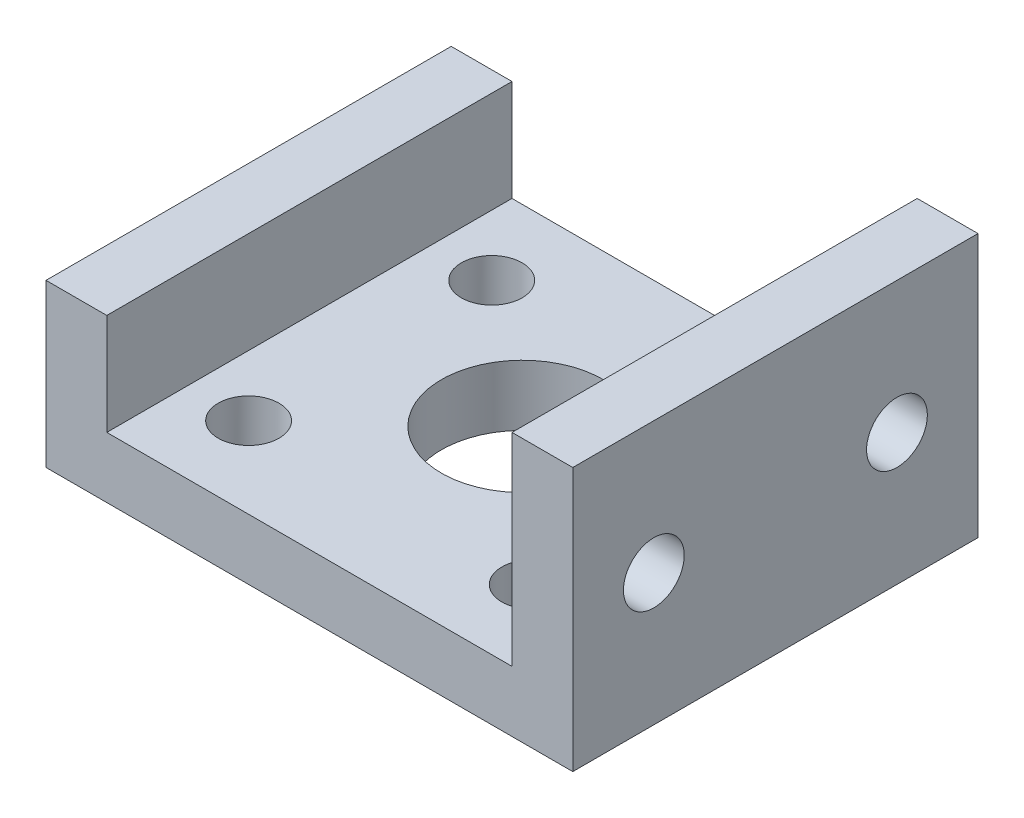
ISO-10303-21;
HEADER;
FILE_DESCRIPTION(('STEP AP214'),'2;1');
FILE_NAME('part.step','',(''),(''),'','','');
FILE_SCHEMA(('AUTOMOTIVE_DESIGN { 1 0 10303 214 1 1 1 1 }'));
ENDSEC;
DATA;
#1=APPLICATION_CONTEXT('core data for automotive mechanical design processes');
#2=APPLICATION_PROTOCOL_DEFINITION('international standard','automotive_design',2000,#1);
#3=PRODUCT_CONTEXT('',#1,'mechanical');
#4=PRODUCT('Part','Part','',(#3));
#5=PRODUCT_RELATED_PRODUCT_CATEGORY('part','',(#4));
#6=PRODUCT_DEFINITION_FORMATION('','',#4);
#7=PRODUCT_DEFINITION_CONTEXT('part definition',#1,'design');
#8=PRODUCT_DEFINITION('design','',#6,#7);
#9=PRODUCT_DEFINITION_SHAPE('','',#8);
#10=(LENGTH_UNIT() NAMED_UNIT(*) SI_UNIT(.MILLI.,.METRE.));
#11=(NAMED_UNIT(*) PLANE_ANGLE_UNIT() SI_UNIT($,.RADIAN.));
#12=(NAMED_UNIT(*) SI_UNIT($,.STERADIAN.) SOLID_ANGLE_UNIT());
#13=UNCERTAINTY_MEASURE_WITH_UNIT(LENGTH_MEASURE(1.E-05),#10,'distance_accuracy_value','');
#14=(GEOMETRIC_REPRESENTATION_CONTEXT(3) GLOBAL_UNCERTAINTY_ASSIGNED_CONTEXT((#13)) GLOBAL_UNIT_ASSIGNED_CONTEXT((#10,
#11,#12)) REPRESENTATION_CONTEXT('',''));
#15=CARTESIAN_POINT('',(0.,0.,0.));
#16=DIRECTION('',(0.,0.,1.));
#17=DIRECTION('',(1.,0.,0.));
#18=AXIS2_PLACEMENT_3D('',#15,#16,#17);
#19=CARTESIAN_POINT('',(0.,0.,160.));
#20=DIRECTION('',(0.,0.,1.));
#21=DIRECTION('',(1.,0.,0.));
#22=AXIS2_PLACEMENT_3D('',#19,#20,#21);
#23=PLANE('',#22);
#24=DIRECTION('',(-1.,0.,0.));
#25=VECTOR('',#24,1.);
#26=CARTESIAN_POINT('',(17.3600305157121,-26.5,160.));
#27=LINE('',#26,#25);
#28=CARTESIAN_POINT('',(17.3600305157121,-26.5,160.));
#29=VERTEX_POINT('',#28);
#30=CARTESIAN_POINT('',(14.3600305157121,-26.5,160.));
#31=VERTEX_POINT('',#30);
#32=EDGE_CURVE('E78',#29,#31,#27,.T.);
#33=ORIENTED_EDGE('',*,*,#32,.T.);
#34=DIRECTION('',(0.,-1.,0.));
#35=VECTOR('',#34,1.);
#36=CARTESIAN_POINT('',(14.3600305157121,36.5,160.));
#37=LINE('',#36,#35);
#38=CARTESIAN_POINT('',(14.3600305157121,-36.5,160.));
#39=VERTEX_POINT('',#38);
#40=EDGE_CURVE('E143',#31,#39,#37,.T.);
#41=ORIENTED_EDGE('',*,*,#40,.T.);
#42=DIRECTION('',(-1.,0.,0.));
#43=VECTOR('',#42,1.);
#44=CARTESIAN_POINT('',(14.3600305157121,-36.5,160.));
#45=LINE('',#44,#43);
#46=CARTESIAN_POINT('',(-5.63996948428791,-36.5,160.));
#47=VERTEX_POINT('',#46);
#48=EDGE_CURVE('E144',#39,#47,#45,.T.);
#49=ORIENTED_EDGE('',*,*,#48,.T.);
#50=DIRECTION('',(0.,1.,0.));
#51=VECTOR('',#50,1.);
#52=CARTESIAN_POINT('',(-5.63996948428791,-36.5,160.));
#53=LINE('',#52,#51);
#54=CARTESIAN_POINT('',(-5.63996948428794,-31.5,160.));
#55=VERTEX_POINT('',#54);
#56=EDGE_CURVE('E147',#47,#55,#53,.T.);
#57=ORIENTED_EDGE('',*,*,#56,.T.);
#58=DIRECTION('',(-1.,0.,0.));
#59=VECTOR('',#58,1.);
#60=CARTESIAN_POINT('',(-8.63996948428794,-31.5,160.));
#61=LINE('',#60,#59);
#62=CARTESIAN_POINT('',(-8.63996948428794,-31.5,160.));
#63=VERTEX_POINT('',#62);
#64=EDGE_CURVE('E129',#55,#63,#61,.T.);
#65=ORIENTED_EDGE('',*,*,#64,.T.);
#66=DIRECTION('',(0.,-1.,0.));
#67=VECTOR('',#66,1.);
#68=CARTESIAN_POINT('',(-8.6399694842879,-35.5,160.));
#69=LINE('',#68,#67);
#70=CARTESIAN_POINT('',(-8.6399694842879,-39.5,160.));
#71=VERTEX_POINT('',#70);
#72=EDGE_CURVE('E176',#63,#71,#69,.T.);
#73=ORIENTED_EDGE('',*,*,#72,.T.);
#74=DIRECTION('',(1.,0.,0.));
#75=VECTOR('',#74,1.);
#76=CARTESIAN_POINT('',(17.3600305157121,-39.5,160.));
#77=LINE('',#76,#75);
#78=CARTESIAN_POINT('',(17.3600305157121,-39.5,160.));
#79=VERTEX_POINT('',#78);
#80=EDGE_CURVE('E88',#71,#79,#77,.T.);
#81=ORIENTED_EDGE('',*,*,#80,.T.);
#82=DIRECTION('',(0.,1.,0.));
#83=VECTOR('',#82,1.);
#84=CARTESIAN_POINT('',(17.3600305157121,39.5,160.));
#85=LINE('',#84,#83);
#86=EDGE_CURVE('E40',#79,#29,#85,.T.);
#87=ORIENTED_EDGE('',*,*,#86,.T.);
#88=EDGE_LOOP('',(#33,#41,#49,#57,#65,#73,#81,#87));
#89=FACE_BOUND('',#88,.T.);
#90=ADVANCED_FACE('F36',(#89),#23,.T.);
#91=CARTESIAN_POINT('',(17.3600305157121,39.5,160.));
#92=DIRECTION('',(-1.,0.,0.));
#93=DIRECTION('',(0.,-1.,0.));
#94=AXIS2_PLACEMENT_3D('',#91,#92,#93);
#95=PLANE('',#94);
#96=CARTESIAN_POINT('',(17.3600305157121,-33.0000000000008,156.));
#97=DIRECTION('',(1.,0.,0.));
#98=DIRECTION('',(0.,1.,0.));
#99=AXIS2_PLACEMENT_3D('',#96,#97,#98);
#100=CIRCLE('',#99,1.5);
#101=CARTESIAN_POINT('',(17.3600305157121,-31.5000000000008,156.));
#102=VERTEX_POINT('',#101);
#103=EDGE_CURVE('E149',#102,#102,#100,.T.);
#104=ORIENTED_EDGE('',*,*,#103,.F.);
#105=EDGE_LOOP('',(#104));
#106=FACE_BOUND('',#105,.T.);
#107=CARTESIAN_POINT('',(17.3600305157121,-33.0000000000008,144.));
#108=DIRECTION('',(1.,0.,0.));
#109=DIRECTION('',(0.,1.,0.));
#110=AXIS2_PLACEMENT_3D('',#107,#108,#109);
#111=CIRCLE('',#110,1.5);
#112=CARTESIAN_POINT('',(17.3600305157121,-31.5000000000008,144.));
#113=VERTEX_POINT('',#112);
#114=EDGE_CURVE('E180',#113,#113,#111,.T.);
#115=ORIENTED_EDGE('',*,*,#114,.F.);
#116=EDGE_LOOP('',(#115));
#117=FACE_BOUND('',#116,.T.);
#118=DIRECTION('',(0.,1.,0.));
#119=VECTOR('',#118,1.);
#120=CARTESIAN_POINT('',(17.3600305157121,-45.3040303009689,140.));
#121=LINE('',#120,#119);
#122=CARTESIAN_POINT('',(17.3600305157121,-39.5,140.));
#123=VERTEX_POINT('',#122);
#124=CARTESIAN_POINT('',(17.3600305157121,-26.5,140.));
#125=VERTEX_POINT('',#124);
#126=EDGE_CURVE('E158',#123,#125,#121,.T.);
#127=ORIENTED_EDGE('',*,*,#126,.T.);
#128=DIRECTION('',(0.,0.,1.));
#129=VECTOR('',#128,1.);
#130=CARTESIAN_POINT('',(17.3600305157121,-26.5,140.));
#131=LINE('',#130,#129);
#132=EDGE_CURVE('E142',#125,#29,#131,.T.);
#133=ORIENTED_EDGE('',*,*,#132,.T.);
#134=ORIENTED_EDGE('',*,*,#86,.F.);
#135=DIRECTION('',(0.,0.,-1.));
#136=VECTOR('',#135,1.);
#137=CARTESIAN_POINT('',(17.3600305157121,-39.5,160.));
#138=LINE('',#137,#136);
#139=EDGE_CURVE('E140',#79,#123,#138,.T.);
#140=ORIENTED_EDGE('',*,*,#139,.T.);
#141=EDGE_LOOP('',(#127,#133,#134,#140));
#142=FACE_BOUND('',#141,.T.);
#143=ADVANCED_FACE('F175',(#106,#117,#142),#95,.F.);
#144=CARTESIAN_POINT('',(17.3600305157121,-39.5,160.));
#145=DIRECTION('',(0.,1.,0.));
#146=DIRECTION('',(-1.,0.,0.));
#147=AXIS2_PLACEMENT_3D('',#144,#145,#146);
#148=PLANE('',#147);
#149=CARTESIAN_POINT('',(11.3600305157119,-39.5,156.));
#150=DIRECTION('',(0.,-1.,0.));
#151=DIRECTION('',(1.,0.,0.));
#152=AXIS2_PLACEMENT_3D('',#149,#150,#151);
#153=CIRCLE('',#152,1.5);
#154=CARTESIAN_POINT('',(12.8600305157119,-39.5,156.));
#155=VERTEX_POINT('',#154);
#156=EDGE_CURVE('E222',#155,#155,#153,.T.);
#157=ORIENTED_EDGE('',*,*,#156,.F.);
#158=EDGE_LOOP('',(#157));
#159=FACE_BOUND('',#158,.T.);
#160=CARTESIAN_POINT('',(11.3600305157119,-39.5,144.));
#161=DIRECTION('',(0.,-1.,0.));
#162=DIRECTION('',(1.,0.,0.));
#163=AXIS2_PLACEMENT_3D('',#160,#161,#162);
#164=CIRCLE('',#163,1.5);
#165=CARTESIAN_POINT('',(12.8600305157119,-39.5,144.));
#166=VERTEX_POINT('',#165);
#167=EDGE_CURVE('E241',#166,#166,#164,.T.);
#168=ORIENTED_EDGE('',*,*,#167,.F.);
#169=EDGE_LOOP('',(#168));
#170=FACE_BOUND('',#169,.T.);
#171=CARTESIAN_POINT('',(-2.63996948428814,-39.5,144.));
#172=DIRECTION('',(0.,-1.,0.));
#173=DIRECTION('',(-1.,0.,0.));
#174=AXIS2_PLACEMENT_3D('',#171,#172,#173);
#175=CIRCLE('',#174,1.5);
#176=CARTESIAN_POINT('',(-4.13996948428815,-39.5,144.));
#177=VERTEX_POINT('',#176);
#178=EDGE_CURVE('E235',#177,#177,#175,.T.);
#179=ORIENTED_EDGE('',*,*,#178,.F.);
#180=EDGE_LOOP('',(#179));
#181=FACE_BOUND('',#180,.T.);
#182=CARTESIAN_POINT('',(-2.63996948428815,-39.5,156.));
#183=DIRECTION('',(0.,-1.,0.));
#184=DIRECTION('',(-1.,0.,0.));
#185=AXIS2_PLACEMENT_3D('',#182,#183,#184);
#186=CIRCLE('',#185,1.5);
#187=CARTESIAN_POINT('',(-4.13996948428815,-39.5,156.));
#188=VERTEX_POINT('',#187);
#189=EDGE_CURVE('E228',#188,#188,#186,.T.);
#190=ORIENTED_EDGE('',*,*,#189,.F.);
#191=EDGE_LOOP('',(#190));
#192=FACE_BOUND('',#191,.T.);
#193=CARTESIAN_POINT('',(4.36003051571187,-39.5,149.485879771382));
#194=DIRECTION('',(0.,-1.,0.));
#195=DIRECTION('',(1.,0.,0.));
#196=AXIS2_PLACEMENT_3D('',#193,#194,#195);
#197=CIRCLE('',#196,4.);
#198=CARTESIAN_POINT('',(8.36003051571187,-39.5,149.485879771382));
#199=VERTEX_POINT('',#198);
#200=EDGE_CURVE('E229',#199,#199,#197,.T.);
#201=ORIENTED_EDGE('',*,*,#200,.F.);
#202=EDGE_LOOP('',(#201));
#203=FACE_BOUND('',#202,.T.);
#204=DIRECTION('',(0.,0.,-1.));
#205=VECTOR('',#204,1.);
#206=CARTESIAN_POINT('',(-8.6399694842879,-39.5,160.));
#207=LINE('',#206,#205);
#208=CARTESIAN_POINT('',(-8.63996948428794,-39.5,140.));
#209=VERTEX_POINT('',#208);
#210=EDGE_CURVE('E137',#71,#209,#207,.T.);
#211=ORIENTED_EDGE('',*,*,#210,.T.);
#212=DIRECTION('',(1.,0.,0.));
#213=VECTOR('',#212,1.);
#214=CARTESIAN_POINT('',(17.3600305157121,-39.5,140.));
#215=LINE('',#214,#213);
#216=EDGE_CURVE('E132',#209,#123,#215,.T.);
#217=ORIENTED_EDGE('',*,*,#216,.T.);
#218=ORIENTED_EDGE('',*,*,#139,.F.);
#219=ORIENTED_EDGE('',*,*,#80,.F.);
#220=EDGE_LOOP('',(#211,#217,#218,#219));
#221=FACE_BOUND('',#220,.T.);
#222=ADVANCED_FACE('F171',(#159,#170,#181,#192,#203,#221),#148,.F.);
#223=CARTESIAN_POINT('',(-8.6399694842879,-35.5,160.));
#224=DIRECTION('',(1.,0.,0.));
#225=DIRECTION('',(0.,1.,0.));
#226=AXIS2_PLACEMENT_3D('',#223,#224,#225);
#227=PLANE('',#226);
#228=DIRECTION('',(0.,0.,-1.));
#229=VECTOR('',#228,1.);
#230=CARTESIAN_POINT('',(-8.63996948428794,-31.5,160.));
#231=LINE('',#230,#229);
#232=CARTESIAN_POINT('',(-8.63996948428794,-31.5,140.));
#233=VERTEX_POINT('',#232);
#234=EDGE_CURVE('E130',#63,#233,#231,.T.);
#235=ORIENTED_EDGE('',*,*,#234,.T.);
#236=DIRECTION('',(0.,1.,0.));
#237=VECTOR('',#236,1.);
#238=CARTESIAN_POINT('',(-8.63996948428794,-45.3040303009689,140.));
#239=LINE('',#238,#237);
#240=EDGE_CURVE('E11',#209,#233,#239,.T.);
#241=ORIENTED_EDGE('',*,*,#240,.F.);
#242=ORIENTED_EDGE('',*,*,#210,.F.);
#243=ORIENTED_EDGE('',*,*,#72,.F.);
#244=EDGE_LOOP('',(#235,#241,#242,#243));
#245=FACE_BOUND('',#244,.T.);
#246=ADVANCED_FACE('F206',(#245),#227,.F.);
#247=CARTESIAN_POINT('',(-8.63996948428794,-31.5,160.));
#248=DIRECTION('',(0.,-1.,0.));
#249=DIRECTION('',(0.,0.,-1.));
#250=AXIS2_PLACEMENT_3D('',#247,#248,#249);
#251=PLANE('',#250);
#252=DIRECTION('',(0.,0.,-1.));
#253=VECTOR('',#252,1.);
#254=CARTESIAN_POINT('',(-5.63996948428794,-31.5,160.));
#255=LINE('',#254,#253);
#256=CARTESIAN_POINT('',(-5.63996948428794,-31.5,140.));
#257=VERTEX_POINT('',#256);
#258=EDGE_CURVE('E117',#55,#257,#255,.T.);
#259=ORIENTED_EDGE('',*,*,#258,.T.);
#260=DIRECTION('',(-1.,0.,0.));
#261=VECTOR('',#260,1.);
#262=CARTESIAN_POINT('',(-8.63996948428794,-31.5,140.));
#263=LINE('',#262,#261);
#264=EDGE_CURVE('E109',#257,#233,#263,.T.);
#265=ORIENTED_EDGE('',*,*,#264,.T.);
#266=ORIENTED_EDGE('',*,*,#234,.F.);
#267=ORIENTED_EDGE('',*,*,#64,.F.);
#268=EDGE_LOOP('',(#259,#265,#266,#267));
#269=FACE_BOUND('',#268,.T.);
#270=ADVANCED_FACE('F128',(#269),#251,.F.);
#271=CARTESIAN_POINT('',(-5.63996948428791,-36.5,160.));
#272=DIRECTION('',(-1.,0.,0.));
#273=DIRECTION('',(0.,-1.,0.));
#274=AXIS2_PLACEMENT_3D('',#271,#272,#273);
#275=PLANE('',#274);
#276=DIRECTION('',(0.,0.,-1.));
#277=VECTOR('',#276,1.);
#278=CARTESIAN_POINT('',(-5.63996948428791,-36.5,160.));
#279=LINE('',#278,#277);
#280=CARTESIAN_POINT('',(-5.63996948428791,-36.5,140.));
#281=VERTEX_POINT('',#280);
#282=EDGE_CURVE('E116',#47,#281,#279,.T.);
#283=ORIENTED_EDGE('',*,*,#282,.T.);
#284=DIRECTION('',(0.,1.,0.));
#285=VECTOR('',#284,1.);
#286=CARTESIAN_POINT('',(-5.63996948428791,-36.4999999999999,140.));
#287=LINE('',#286,#285);
#288=EDGE_CURVE('E106',#281,#257,#287,.T.);
#289=ORIENTED_EDGE('',*,*,#288,.T.);
#290=ORIENTED_EDGE('',*,*,#258,.F.);
#291=ORIENTED_EDGE('',*,*,#56,.F.);
#292=EDGE_LOOP('',(#283,#289,#290,#291));
#293=FACE_BOUND('',#292,.T.);
#294=ADVANCED_FACE('F122',(#293),#275,.F.);
#295=CARTESIAN_POINT('',(14.3600305157121,-36.5,160.));
#296=DIRECTION('',(0.,-1.,0.));
#297=DIRECTION('',(1.,0.,0.));
#298=AXIS2_PLACEMENT_3D('',#295,#296,#297);
#299=PLANE('',#298);
#300=CARTESIAN_POINT('',(11.3600305157119,-36.5,156.));
#301=DIRECTION('',(0.,-1.,0.));
#302=DIRECTION('',(1.,0.,0.));
#303=AXIS2_PLACEMENT_3D('',#300,#301,#302);
#304=CIRCLE('',#303,1.5);
#305=CARTESIAN_POINT('',(12.8600305157119,-36.5,156.));
#306=VERTEX_POINT('',#305);
#307=EDGE_CURVE('E218',#306,#306,#304,.F.);
#308=ORIENTED_EDGE('',*,*,#307,.F.);
#309=EDGE_LOOP('',(#308));
#310=FACE_BOUND('',#309,.T.);
#311=CARTESIAN_POINT('',(11.3600305157119,-36.5,144.));
#312=DIRECTION('',(0.,-1.,0.));
#313=DIRECTION('',(1.,0.,0.));
#314=AXIS2_PLACEMENT_3D('',#311,#312,#313);
#315=CIRCLE('',#314,1.5);
#316=CARTESIAN_POINT('',(12.8600305157119,-36.5,144.));
#317=VERTEX_POINT('',#316);
#318=EDGE_CURVE('E244',#317,#317,#315,.F.);
#319=ORIENTED_EDGE('',*,*,#318,.F.);
#320=EDGE_LOOP('',(#319));
#321=FACE_BOUND('',#320,.T.);
#322=CARTESIAN_POINT('',(-2.63996948428815,-36.5,144.));
#323=DIRECTION('',(0.,-1.,0.));
#324=DIRECTION('',(1.,0.,0.));
#325=AXIS2_PLACEMENT_3D('',#322,#323,#324);
#326=CIRCLE('',#325,1.5);
#327=CARTESIAN_POINT('',(-1.13996948428814,-36.5,144.));
#328=VERTEX_POINT('',#327);
#329=EDGE_CURVE('E238',#328,#328,#326,.F.);
#330=ORIENTED_EDGE('',*,*,#329,.F.);
#331=EDGE_LOOP('',(#330));
#332=FACE_BOUND('',#331,.T.);
#333=CARTESIAN_POINT('',(-2.63996948428815,-36.5,156.));
#334=DIRECTION('',(0.,-1.,0.));
#335=DIRECTION('',(1.,0.,0.));
#336=AXIS2_PLACEMENT_3D('',#333,#334,#335);
#337=CIRCLE('',#336,1.5);
#338=CARTESIAN_POINT('',(-1.13996948428815,-36.5,156.));
#339=VERTEX_POINT('',#338);
#340=EDGE_CURVE('E232',#339,#339,#337,.F.);
#341=ORIENTED_EDGE('',*,*,#340,.F.);
#342=EDGE_LOOP('',(#341));
#343=FACE_BOUND('',#342,.T.);
#344=CARTESIAN_POINT('',(4.36003051571187,-36.5,149.485879771382));
#345=DIRECTION('',(0.,-1.,0.));
#346=DIRECTION('',(1.,0.,0.));
#347=AXIS2_PLACEMENT_3D('',#344,#345,#346);
#348=CIRCLE('',#347,4.);
#349=CARTESIAN_POINT('',(8.36003051571187,-36.5,149.485879771382));
#350=VERTEX_POINT('',#349);
#351=EDGE_CURVE('E225',#350,#350,#348,.F.);
#352=ORIENTED_EDGE('',*,*,#351,.F.);
#353=EDGE_LOOP('',(#352));
#354=FACE_BOUND('',#353,.T.);
#355=DIRECTION('',(0.,0.,-1.));
#356=VECTOR('',#355,1.);
#357=CARTESIAN_POINT('',(14.3600305157121,-36.5,160.));
#358=LINE('',#357,#356);
#359=CARTESIAN_POINT('',(14.3600305157121,-36.5,140.));
#360=VERTEX_POINT('',#359);
#361=EDGE_CURVE('E126',#39,#360,#358,.T.);
#362=ORIENTED_EDGE('',*,*,#361,.T.);
#363=DIRECTION('',(-1.,0.,0.));
#364=VECTOR('',#363,1.);
#365=CARTESIAN_POINT('',(14.3600305157121,-36.5,140.));
#366=LINE('',#365,#364);
#367=EDGE_CURVE('E161',#360,#281,#366,.T.);
#368=ORIENTED_EDGE('',*,*,#367,.T.);
#369=ORIENTED_EDGE('',*,*,#282,.F.);
#370=ORIENTED_EDGE('',*,*,#48,.F.);
#371=EDGE_LOOP('',(#362,#368,#369,#370));
#372=FACE_BOUND('',#371,.T.);
#373=ADVANCED_FACE('F184',(#310,#321,#332,#343,#354,#372),#299,.F.);
#374=CARTESIAN_POINT('',(14.3600305157121,36.5,160.));
#375=DIRECTION('',(1.,0.,0.));
#376=DIRECTION('',(0.,0.,-1.));
#377=AXIS2_PLACEMENT_3D('',#374,#375,#376);
#378=PLANE('',#377);
#379=CARTESIAN_POINT('',(14.3600305157121,-33.0000000000008,156.));
#380=DIRECTION('',(1.,0.,0.));
#381=DIRECTION('',(0.,0.,-1.));
#382=AXIS2_PLACEMENT_3D('',#379,#380,#381);
#383=CIRCLE('',#382,1.5);
#384=CARTESIAN_POINT('',(14.3600305157121,-33.0000000000008,154.5));
#385=VERTEX_POINT('',#384);
#386=EDGE_CURVE('E152',#385,#385,#383,.F.);
#387=ORIENTED_EDGE('',*,*,#386,.F.);
#388=EDGE_LOOP('',(#387));
#389=FACE_BOUND('',#388,.T.);
#390=CARTESIAN_POINT('',(14.3600305157121,-33.0000000000008,144.));
#391=DIRECTION('',(1.,0.,0.));
#392=DIRECTION('',(0.,0.,-1.));
#393=AXIS2_PLACEMENT_3D('',#390,#391,#392);
#394=CIRCLE('',#393,1.5);
#395=CARTESIAN_POINT('',(14.3600305157121,-33.0000000000008,142.5));
#396=VERTEX_POINT('',#395);
#397=EDGE_CURVE('E214',#396,#396,#394,.F.);
#398=ORIENTED_EDGE('',*,*,#397,.F.);
#399=EDGE_LOOP('',(#398));
#400=FACE_BOUND('',#399,.T.);
#401=ORIENTED_EDGE('',*,*,#40,.F.);
#402=DIRECTION('',(0.,0.,-1.));
#403=VECTOR('',#402,1.);
#404=CARTESIAN_POINT('',(14.3600305157121,-26.5,160.));
#405=LINE('',#404,#403);
#406=CARTESIAN_POINT('',(14.3600305157121,-26.5,140.));
#407=VERTEX_POINT('',#406);
#408=EDGE_CURVE('E164',#31,#407,#405,.T.);
#409=ORIENTED_EDGE('',*,*,#408,.T.);
#410=DIRECTION('',(0.,-1.,0.));
#411=VECTOR('',#410,1.);
#412=CARTESIAN_POINT('',(14.3600305157121,36.5000000000001,140.));
#413=LINE('',#412,#411);
#414=EDGE_CURVE('E55',#407,#360,#413,.T.);
#415=ORIENTED_EDGE('',*,*,#414,.T.);
#416=ORIENTED_EDGE('',*,*,#361,.F.);
#417=EDGE_LOOP('',(#401,#409,#415,#416));
#418=FACE_BOUND('',#417,.T.);
#419=ADVANCED_FACE('F38',(#389,#400,#418),#378,.F.);
#420=CARTESIAN_POINT('',(17.3600305157121,-26.5,140.));
#421=DIRECTION('',(0.,-1.,0.));
#422=DIRECTION('',(1.,0.,0.));
#423=AXIS2_PLACEMENT_3D('',#420,#421,#422);
#424=PLANE('',#423);
#425=ORIENTED_EDGE('',*,*,#32,.F.);
#426=ORIENTED_EDGE('',*,*,#132,.F.);
#427=DIRECTION('',(-1.,0.,0.));
#428=VECTOR('',#427,1.);
#429=CARTESIAN_POINT('',(17.3600305157121,-26.5,140.));
#430=LINE('',#429,#428);
#431=EDGE_CURVE('E46',#125,#407,#430,.T.);
#432=ORIENTED_EDGE('',*,*,#431,.T.);
#433=ORIENTED_EDGE('',*,*,#408,.F.);
#434=EDGE_LOOP('',(#425,#426,#432,#433));
#435=FACE_BOUND('',#434,.T.);
#436=ADVANCED_FACE('F192',(#435),#424,.F.);
#437=CARTESIAN_POINT('',(17.3600305157121,-45.3040303009689,140.));
#438=DIRECTION('',(0.,0.,1.));
#439=DIRECTION('',(0.,-1.,0.));
#440=AXIS2_PLACEMENT_3D('',#437,#438,#439);
#441=PLANE('',#440);
#442=ORIENTED_EDGE('',*,*,#431,.F.);
#443=ORIENTED_EDGE('',*,*,#126,.F.);
#444=ORIENTED_EDGE('',*,*,#216,.F.);
#445=ORIENTED_EDGE('',*,*,#240,.T.);
#446=ORIENTED_EDGE('',*,*,#264,.F.);
#447=ORIENTED_EDGE('',*,*,#288,.F.);
#448=ORIENTED_EDGE('',*,*,#367,.F.);
#449=ORIENTED_EDGE('',*,*,#414,.F.);
#450=EDGE_LOOP('',(#442,#443,#444,#445,#446,#447,#448,#449));
#451=FACE_BOUND('',#450,.T.);
#452=ADVANCED_FACE('F110',(#451),#441,.F.);
#453=CARTESIAN_POINT('',(-8.64096948428796,-33.0000000000008,144.));
#454=DIRECTION('',(1.,0.,0.));
#455=DIRECTION('',(0.,1.,0.));
#456=AXIS2_PLACEMENT_3D('',#453,#454,#455);
#457=CYLINDRICAL_SURFACE('',#456,1.5);
#458=ORIENTED_EDGE('',*,*,#114,.T.);
#459=EDGE_LOOP('',(#458));
#460=FACE_BOUND('',#459,.T.);
#461=ORIENTED_EDGE('',*,*,#397,.T.);
#462=EDGE_LOOP('',(#461));
#463=FACE_BOUND('',#462,.T.);
#464=ADVANCED_FACE('F278',(#460,#463),#457,.F.);
#465=CARTESIAN_POINT('',(-8.64096948428796,-33.0000000000008,156.));
#466=DIRECTION('',(1.,0.,0.));
#467=DIRECTION('',(0.,1.,0.));
#468=AXIS2_PLACEMENT_3D('',#465,#466,#467);
#469=CYLINDRICAL_SURFACE('',#468,1.5);
#470=ORIENTED_EDGE('',*,*,#103,.T.);
#471=EDGE_LOOP('',(#470));
#472=FACE_BOUND('',#471,.T.);
#473=ORIENTED_EDGE('',*,*,#386,.T.);
#474=EDGE_LOOP('',(#473));
#475=FACE_BOUND('',#474,.T.);
#476=ADVANCED_FACE('F267',(#472,#475),#469,.F.);
#477=CARTESIAN_POINT('',(4.36003051571185,39.501,149.485879771382));
#478=DIRECTION('',(0.,-1.,0.));
#479=DIRECTION('',(1.,0.,0.));
#480=AXIS2_PLACEMENT_3D('',#477,#478,#479);
#481=CYLINDRICAL_SURFACE('',#480,4.);
#482=ORIENTED_EDGE('',*,*,#200,.T.);
#483=EDGE_LOOP('',(#482));
#484=FACE_BOUND('',#483,.T.);
#485=ORIENTED_EDGE('',*,*,#351,.T.);
#486=EDGE_LOOP('',(#485));
#487=FACE_BOUND('',#486,.T.);
#488=ADVANCED_FACE('F263',(#484,#487),#481,.F.);
#489=CARTESIAN_POINT('',(-2.63996948428817,39.501,156.));
#490=DIRECTION('',(0.,-1.,0.));
#491=DIRECTION('',(1.,0.,0.));
#492=AXIS2_PLACEMENT_3D('',#489,#490,#491);
#493=CYLINDRICAL_SURFACE('',#492,1.5);
#494=ORIENTED_EDGE('',*,*,#189,.T.);
#495=EDGE_LOOP('',(#494));
#496=FACE_BOUND('',#495,.T.);
#497=ORIENTED_EDGE('',*,*,#340,.T.);
#498=EDGE_LOOP('',(#497));
#499=FACE_BOUND('',#498,.T.);
#500=ADVANCED_FACE('F266',(#496,#499),#493,.F.);
#501=CARTESIAN_POINT('',(-2.63996948428817,39.501,144.));
#502=DIRECTION('',(0.,-1.,0.));
#503=DIRECTION('',(1.,0.,0.));
#504=AXIS2_PLACEMENT_3D('',#501,#502,#503);
#505=CYLINDRICAL_SURFACE('',#504,1.5);
#506=ORIENTED_EDGE('',*,*,#178,.T.);
#507=EDGE_LOOP('',(#506));
#508=FACE_BOUND('',#507,.T.);
#509=ORIENTED_EDGE('',*,*,#329,.T.);
#510=EDGE_LOOP('',(#509));
#511=FACE_BOUND('',#510,.T.);
#512=ADVANCED_FACE('F275',(#508,#511),#505,.F.);
#513=CARTESIAN_POINT('',(11.3600305157119,39.501,144.));
#514=DIRECTION('',(0.,-1.,0.));
#515=DIRECTION('',(1.,0.,0.));
#516=AXIS2_PLACEMENT_3D('',#513,#514,#515);
#517=CYLINDRICAL_SURFACE('',#516,1.5);
#518=ORIENTED_EDGE('',*,*,#167,.T.);
#519=EDGE_LOOP('',(#518));
#520=FACE_BOUND('',#519,.T.);
#521=ORIENTED_EDGE('',*,*,#318,.T.);
#522=EDGE_LOOP('',(#521));
#523=FACE_BOUND('',#522,.T.);
#524=ADVANCED_FACE('F366',(#520,#523),#517,.F.);
#525=CARTESIAN_POINT('',(11.3600305157119,39.501,156.));
#526=DIRECTION('',(0.,-1.,0.));
#527=DIRECTION('',(1.,0.,0.));
#528=AXIS2_PLACEMENT_3D('',#525,#526,#527);
#529=CYLINDRICAL_SURFACE('',#528,1.5);
#530=ORIENTED_EDGE('',*,*,#156,.T.);
#531=EDGE_LOOP('',(#530));
#532=FACE_BOUND('',#531,.T.);
#533=ORIENTED_EDGE('',*,*,#307,.T.);
#534=EDGE_LOOP('',(#533));
#535=FACE_BOUND('',#534,.T.);
#536=ADVANCED_FACE('F252',(#532,#535),#529,.F.);
#537=CLOSED_SHELL('',(#90,#143,#222,#246,#270,#294,#373,#419,#436,#452,#464,#476,#488,#500,#512,
#524,#536));
#538=MANIFOLD_SOLID_BREP('B2',#537);
#539=ADVANCED_BREP_SHAPE_REPRESENTATION('',(#18,#538),#14);
#540=SHAPE_DEFINITION_REPRESENTATION(#9,#539);
ENDSEC;
END-ISO-10303-21;
